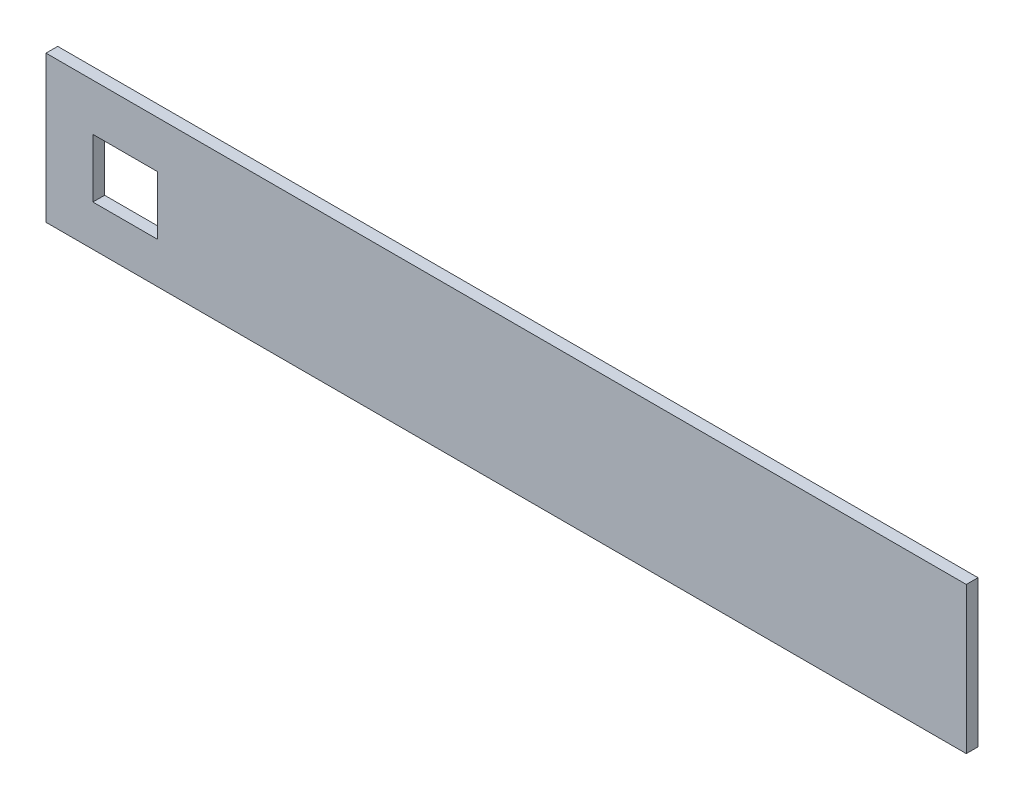
ISO-10303-21;
HEADER;
FILE_DESCRIPTION(('STEP AP214'),'2;1');
FILE_NAME('part.step','',(''),(''),'','','');
FILE_SCHEMA(('AUTOMOTIVE_DESIGN { 1 0 10303 214 1 1 1 1 }'));
ENDSEC;
DATA;
#1=APPLICATION_CONTEXT('core data for automotive mechanical design processes');
#2=APPLICATION_PROTOCOL_DEFINITION('international standard','automotive_design',2000,#1);
#3=PRODUCT_CONTEXT('',#1,'mechanical');
#4=PRODUCT('Part','Part','',(#3));
#5=PRODUCT_RELATED_PRODUCT_CATEGORY('part','',(#4));
#6=PRODUCT_DEFINITION_FORMATION('','',#4);
#7=PRODUCT_DEFINITION_CONTEXT('part definition',#1,'design');
#8=PRODUCT_DEFINITION('design','',#6,#7);
#9=PRODUCT_DEFINITION_SHAPE('','',#8);
#10=(LENGTH_UNIT() NAMED_UNIT(*) SI_UNIT(.MILLI.,.METRE.));
#11=(NAMED_UNIT(*) PLANE_ANGLE_UNIT() SI_UNIT($,.RADIAN.));
#12=(NAMED_UNIT(*) SI_UNIT($,.STERADIAN.) SOLID_ANGLE_UNIT());
#13=UNCERTAINTY_MEASURE_WITH_UNIT(LENGTH_MEASURE(1.E-05),#10,'distance_accuracy_value','');
#14=(GEOMETRIC_REPRESENTATION_CONTEXT(3) GLOBAL_UNCERTAINTY_ASSIGNED_CONTEXT((#13)) GLOBAL_UNIT_ASSIGNED_CONTEXT((#10,
#11,#12)) REPRESENTATION_CONTEXT('',''));
#15=CARTESIAN_POINT('',(0.,0.,0.));
#16=DIRECTION('',(0.,0.,1.));
#17=DIRECTION('',(1.,0.,0.));
#18=AXIS2_PLACEMENT_3D('',#15,#16,#17);
#19=CARTESIAN_POINT('',(78.5,12.5,2.));
#20=DIRECTION('',(-1.,0.,0.));
#21=DIRECTION('',(0.,-1.,0.));
#22=AXIS2_PLACEMENT_3D('',#19,#20,#21);
#23=PLANE('',#22);
#24=DIRECTION('',(0.,1.,0.));
#25=VECTOR('',#24,1.);
#26=CARTESIAN_POINT('',(78.5,12.5,0.));
#27=LINE('',#26,#25);
#28=CARTESIAN_POINT('',(78.5,-12.5,0.));
#29=VERTEX_POINT('',#28);
#30=CARTESIAN_POINT('',(78.5,12.5,0.));
#31=VERTEX_POINT('',#30);
#32=EDGE_CURVE('E136',#29,#31,#27,.T.);
#33=ORIENTED_EDGE('',*,*,#32,.T.);
#34=DIRECTION('',(0.,0.,-1.));
#35=VECTOR('',#34,1.);
#36=CARTESIAN_POINT('',(78.5,12.5,2.));
#37=LINE('',#36,#35);
#38=CARTESIAN_POINT('',(78.5,12.5,2.));
#39=VERTEX_POINT('',#38);
#40=EDGE_CURVE('E12',#39,#31,#37,.T.);
#41=ORIENTED_EDGE('',*,*,#40,.F.);
#42=DIRECTION('',(0.,1.,0.));
#43=VECTOR('',#42,1.);
#44=CARTESIAN_POINT('',(78.5,12.5,2.));
#45=LINE('',#44,#43);
#46=CARTESIAN_POINT('',(78.5,-12.5,2.));
#47=VERTEX_POINT('',#46);
#48=EDGE_CURVE('E140',#47,#39,#45,.T.);
#49=ORIENTED_EDGE('',*,*,#48,.F.);
#50=DIRECTION('',(0.,0.,-1.));
#51=VECTOR('',#50,1.);
#52=CARTESIAN_POINT('',(78.5,-12.5,2.));
#53=LINE('',#52,#51);
#54=EDGE_CURVE('E150',#47,#29,#53,.T.);
#55=ORIENTED_EDGE('',*,*,#54,.T.);
#56=EDGE_LOOP('',(#33,#41,#49,#55));
#57=FACE_BOUND('',#56,.T.);
#58=ADVANCED_FACE('F38',(#57),#23,.F.);
#59=CARTESIAN_POINT('',(-78.5,12.5,2.));
#60=DIRECTION('',(0.,-1.,0.));
#61=DIRECTION('',(0.,0.,-1.));
#62=AXIS2_PLACEMENT_3D('',#59,#60,#61);
#63=PLANE('',#62);
#64=DIRECTION('',(-1.,0.,0.));
#65=VECTOR('',#64,1.);
#66=CARTESIAN_POINT('',(-78.5,12.5,0.));
#67=LINE('',#66,#65);
#68=CARTESIAN_POINT('',(-78.5,12.5,0.));
#69=VERTEX_POINT('',#68);
#70=EDGE_CURVE('E153',#31,#69,#67,.T.);
#71=ORIENTED_EDGE('',*,*,#70,.T.);
#72=DIRECTION('',(0.,0.,-1.));
#73=VECTOR('',#72,1.);
#74=CARTESIAN_POINT('',(-78.5,12.5,2.));
#75=LINE('',#74,#73);
#76=CARTESIAN_POINT('',(-78.5,12.5,2.));
#77=VERTEX_POINT('',#76);
#78=EDGE_CURVE('E45',#77,#69,#75,.T.);
#79=ORIENTED_EDGE('',*,*,#78,.F.);
#80=DIRECTION('',(-1.,0.,0.));
#81=VECTOR('',#80,1.);
#82=CARTESIAN_POINT('',(-78.5,12.5,2.));
#83=LINE('',#82,#81);
#84=EDGE_CURVE('E143',#39,#77,#83,.T.);
#85=ORIENTED_EDGE('',*,*,#84,.F.);
#86=ORIENTED_EDGE('',*,*,#40,.T.);
#87=EDGE_LOOP('',(#71,#79,#85,#86));
#88=FACE_BOUND('',#87,.T.);
#89=ADVANCED_FACE('F181',(#88),#63,.F.);
#90=CARTESIAN_POINT('',(-78.5,12.5,2.));
#91=DIRECTION('',(1.,0.,0.));
#92=DIRECTION('',(0.,1.,0.));
#93=AXIS2_PLACEMENT_3D('',#90,#91,#92);
#94=PLANE('',#93);
#95=DIRECTION('',(0.,-1.,0.));
#96=VECTOR('',#95,1.);
#97=CARTESIAN_POINT('',(-78.5,12.5,0.));
#98=LINE('',#97,#96);
#99=CARTESIAN_POINT('',(-78.5,-12.5,0.));
#100=VERTEX_POINT('',#99);
#101=EDGE_CURVE('E155',#69,#100,#98,.T.);
#102=ORIENTED_EDGE('',*,*,#101,.T.);
#103=DIRECTION('',(0.,0.,-1.));
#104=VECTOR('',#103,1.);
#105=CARTESIAN_POINT('',(-78.5,-12.5,2.));
#106=LINE('',#105,#104);
#107=CARTESIAN_POINT('',(-78.5,-12.5,2.));
#108=VERTEX_POINT('',#107);
#109=EDGE_CURVE('E160',#108,#100,#106,.T.);
#110=ORIENTED_EDGE('',*,*,#109,.F.);
#111=DIRECTION('',(0.,-1.,0.));
#112=VECTOR('',#111,1.);
#113=CARTESIAN_POINT('',(-78.5,12.5,2.));
#114=LINE('',#113,#112);
#115=EDGE_CURVE('E146',#77,#108,#114,.T.);
#116=ORIENTED_EDGE('',*,*,#115,.F.);
#117=ORIENTED_EDGE('',*,*,#78,.T.);
#118=EDGE_LOOP('',(#102,#110,#116,#117));
#119=FACE_BOUND('',#118,.T.);
#120=ADVANCED_FACE('F167',(#119),#94,.F.);
#121=CARTESIAN_POINT('',(-78.5,-12.5,2.));
#122=DIRECTION('',(0.,1.,0.));
#123=DIRECTION('',(0.,0.,1.));
#124=AXIS2_PLACEMENT_3D('',#121,#122,#123);
#125=PLANE('',#124);
#126=DIRECTION('',(1.,0.,0.));
#127=VECTOR('',#126,1.);
#128=CARTESIAN_POINT('',(-78.5,-12.5,0.));
#129=LINE('',#128,#127);
#130=EDGE_CURVE('E144',#100,#29,#129,.T.);
#131=ORIENTED_EDGE('',*,*,#130,.T.);
#132=ORIENTED_EDGE('',*,*,#54,.F.);
#133=DIRECTION('',(1.,0.,0.));
#134=VECTOR('',#133,1.);
#135=CARTESIAN_POINT('',(-78.5,-12.5,2.));
#136=LINE('',#135,#134);
#137=EDGE_CURVE('E148',#108,#47,#136,.T.);
#138=ORIENTED_EDGE('',*,*,#137,.F.);
#139=ORIENTED_EDGE('',*,*,#109,.T.);
#140=EDGE_LOOP('',(#131,#132,#138,#139));
#141=FACE_BOUND('',#140,.T.);
#142=ADVANCED_FACE('F174',(#141),#125,.F.);
#143=CARTESIAN_POINT('',(0.,0.,2.));
#144=DIRECTION('',(0.,0.,1.));
#145=DIRECTION('',(1.,0.,0.));
#146=AXIS2_PLACEMENT_3D('',#143,#144,#145);
#147=PLANE('',#146);
#148=DIRECTION('',(0.,-1.,0.));
#149=VECTOR('',#148,1.);
#150=CARTESIAN_POINT('',(-70.5,4.5,2.));
#151=LINE('',#150,#149);
#152=CARTESIAN_POINT('',(-70.5,4.5,2.));
#153=VERTEX_POINT('',#152);
#154=CARTESIAN_POINT('',(-70.5,-5.5,2.));
#155=VERTEX_POINT('',#154);
#156=EDGE_CURVE('E52',#153,#155,#151,.T.);
#157=ORIENTED_EDGE('',*,*,#156,.F.);
#158=DIRECTION('',(-1.,0.,0.));
#159=VECTOR('',#158,1.);
#160=CARTESIAN_POINT('',(-70.5,4.5,2.));
#161=LINE('',#160,#159);
#162=CARTESIAN_POINT('',(-59.5,4.5,2.));
#163=VERTEX_POINT('',#162);
#164=EDGE_CURVE('E120',#163,#153,#161,.T.);
#165=ORIENTED_EDGE('',*,*,#164,.F.);
#166=DIRECTION('',(0.,1.,0.));
#167=VECTOR('',#166,1.);
#168=CARTESIAN_POINT('',(-59.5,4.5,2.));
#169=LINE('',#168,#167);
#170=CARTESIAN_POINT('',(-59.5,-5.5,2.));
#171=VERTEX_POINT('',#170);
#172=EDGE_CURVE('E124',#171,#163,#169,.T.);
#173=ORIENTED_EDGE('',*,*,#172,.F.);
#174=DIRECTION('',(1.,0.,0.));
#175=VECTOR('',#174,1.);
#176=CARTESIAN_POINT('',(-70.5,-5.5,2.));
#177=LINE('',#176,#175);
#178=EDGE_CURVE('E129',#155,#171,#177,.T.);
#179=ORIENTED_EDGE('',*,*,#178,.F.);
#180=EDGE_LOOP('',(#157,#165,#173,#179));
#181=FACE_BOUND('',#180,.T.);
#182=ORIENTED_EDGE('',*,*,#48,.T.);
#183=ORIENTED_EDGE('',*,*,#84,.T.);
#184=ORIENTED_EDGE('',*,*,#115,.T.);
#185=ORIENTED_EDGE('',*,*,#137,.T.);
#186=EDGE_LOOP('',(#182,#183,#184,#185));
#187=FACE_BOUND('',#186,.T.);
#188=ADVANCED_FACE('F180',(#181,#187),#147,.T.);
#189=CARTESIAN_POINT('',(0.,0.,0.));
#190=DIRECTION('',(0.,0.,1.));
#191=DIRECTION('',(1.,0.,0.));
#192=AXIS2_PLACEMENT_3D('',#189,#190,#191);
#193=PLANE('',#192);
#194=DIRECTION('',(-1.,0.,0.));
#195=VECTOR('',#194,1.);
#196=CARTESIAN_POINT('',(-70.5,4.5,0.));
#197=LINE('',#196,#195);
#198=CARTESIAN_POINT('',(-59.5,4.5,0.));
#199=VERTEX_POINT('',#198);
#200=CARTESIAN_POINT('',(-70.5,4.5,0.));
#201=VERTEX_POINT('',#200);
#202=EDGE_CURVE('E110',#199,#201,#197,.T.);
#203=ORIENTED_EDGE('',*,*,#202,.T.);
#204=DIRECTION('',(0.,-1.,0.));
#205=VECTOR('',#204,1.);
#206=CARTESIAN_POINT('',(-70.5,4.5,0.));
#207=LINE('',#206,#205);
#208=CARTESIAN_POINT('',(-70.5,-5.5,0.));
#209=VERTEX_POINT('',#208);
#210=EDGE_CURVE('E104',#201,#209,#207,.T.);
#211=ORIENTED_EDGE('',*,*,#210,.T.);
#212=DIRECTION('',(1.,0.,0.));
#213=VECTOR('',#212,1.);
#214=CARTESIAN_POINT('',(-70.5,-5.5,0.));
#215=LINE('',#214,#213);
#216=CARTESIAN_POINT('',(-59.5,-5.5,0.));
#217=VERTEX_POINT('',#216);
#218=EDGE_CURVE('E113',#209,#217,#215,.T.);
#219=ORIENTED_EDGE('',*,*,#218,.T.);
#220=DIRECTION('',(0.,1.,0.));
#221=VECTOR('',#220,1.);
#222=CARTESIAN_POINT('',(-59.5,4.5,0.));
#223=LINE('',#222,#221);
#224=EDGE_CURVE('E60',#217,#199,#223,.T.);
#225=ORIENTED_EDGE('',*,*,#224,.T.);
#226=EDGE_LOOP('',(#203,#211,#219,#225));
#227=FACE_BOUND('',#226,.T.);
#228=ORIENTED_EDGE('',*,*,#32,.F.);
#229=ORIENTED_EDGE('',*,*,#130,.F.);
#230=ORIENTED_EDGE('',*,*,#101,.F.);
#231=ORIENTED_EDGE('',*,*,#70,.F.);
#232=EDGE_LOOP('',(#228,#229,#230,#231));
#233=FACE_BOUND('',#232,.T.);
#234=ADVANCED_FACE('F117',(#227,#233),#193,.F.);
#235=CARTESIAN_POINT('',(-70.5,4.5,0.));
#236=DIRECTION('',(-1.,0.,0.));
#237=DIRECTION('',(0.,0.,1.));
#238=AXIS2_PLACEMENT_3D('',#235,#236,#237);
#239=PLANE('',#238);
#240=ORIENTED_EDGE('',*,*,#156,.T.);
#241=DIRECTION('',(0.,0.,1.));
#242=VECTOR('',#241,1.);
#243=CARTESIAN_POINT('',(-70.5,-5.5,0.));
#244=LINE('',#243,#242);
#245=EDGE_CURVE('E100',#209,#155,#244,.T.);
#246=ORIENTED_EDGE('',*,*,#245,.F.);
#247=ORIENTED_EDGE('',*,*,#210,.F.);
#248=DIRECTION('',(0.,0.,1.));
#249=VECTOR('',#248,1.);
#250=CARTESIAN_POINT('',(-70.5,4.5,0.));
#251=LINE('',#250,#249);
#252=EDGE_CURVE('E134',#201,#153,#251,.T.);
#253=ORIENTED_EDGE('',*,*,#252,.T.);
#254=EDGE_LOOP('',(#240,#246,#247,#253));
#255=FACE_BOUND('',#254,.T.);
#256=ADVANCED_FACE('F102',(#255),#239,.F.);
#257=CARTESIAN_POINT('',(-70.5,4.5,0.));
#258=DIRECTION('',(0.,1.,0.));
#259=DIRECTION('',(-1.,0.,0.));
#260=AXIS2_PLACEMENT_3D('',#257,#258,#259);
#261=PLANE('',#260);
#262=ORIENTED_EDGE('',*,*,#164,.T.);
#263=ORIENTED_EDGE('',*,*,#252,.F.);
#264=ORIENTED_EDGE('',*,*,#202,.F.);
#265=DIRECTION('',(0.,0.,1.));
#266=VECTOR('',#265,1.);
#267=CARTESIAN_POINT('',(-59.5,4.5,0.));
#268=LINE('',#267,#266);
#269=EDGE_CURVE('E137',#199,#163,#268,.T.);
#270=ORIENTED_EDGE('',*,*,#269,.T.);
#271=EDGE_LOOP('',(#262,#263,#264,#270));
#272=FACE_BOUND('',#271,.T.);
#273=ADVANCED_FACE('F198',(#272),#261,.F.);
#274=CARTESIAN_POINT('',(-59.5,4.5,0.));
#275=DIRECTION('',(1.,0.,0.));
#276=DIRECTION('',(0.,0.,-1.));
#277=AXIS2_PLACEMENT_3D('',#274,#275,#276);
#278=PLANE('',#277);
#279=ORIENTED_EDGE('',*,*,#172,.T.);
#280=ORIENTED_EDGE('',*,*,#269,.F.);
#281=ORIENTED_EDGE('',*,*,#224,.F.);
#282=DIRECTION('',(0.,0.,1.));
#283=VECTOR('',#282,1.);
#284=CARTESIAN_POINT('',(-59.5,-5.5,0.));
#285=LINE('',#284,#283);
#286=EDGE_CURVE('E109',#217,#171,#285,.T.);
#287=ORIENTED_EDGE('',*,*,#286,.T.);
#288=EDGE_LOOP('',(#279,#280,#281,#287));
#289=FACE_BOUND('',#288,.T.);
#290=ADVANCED_FACE('F201',(#289),#278,.F.);
#291=CARTESIAN_POINT('',(-70.5,-5.5,0.));
#292=DIRECTION('',(0.,-1.,0.));
#293=DIRECTION('',(1.,0.,0.));
#294=AXIS2_PLACEMENT_3D('',#291,#292,#293);
#295=PLANE('',#294);
#296=ORIENTED_EDGE('',*,*,#178,.T.);
#297=ORIENTED_EDGE('',*,*,#286,.F.);
#298=ORIENTED_EDGE('',*,*,#218,.F.);
#299=ORIENTED_EDGE('',*,*,#245,.T.);
#300=EDGE_LOOP('',(#296,#297,#298,#299));
#301=FACE_BOUND('',#300,.T.);
#302=ADVANCED_FACE('F114',(#301),#295,.F.);
#303=CLOSED_SHELL('',(#58,#89,#120,#142,#188,#234,#256,#273,#290,#302));
#304=MANIFOLD_SOLID_BREP('B2',#303);
#305=ADVANCED_BREP_SHAPE_REPRESENTATION('',(#18,#304),#14);
#306=SHAPE_DEFINITION_REPRESENTATION(#9,#305);
ENDSEC;
END-ISO-10303-21;
